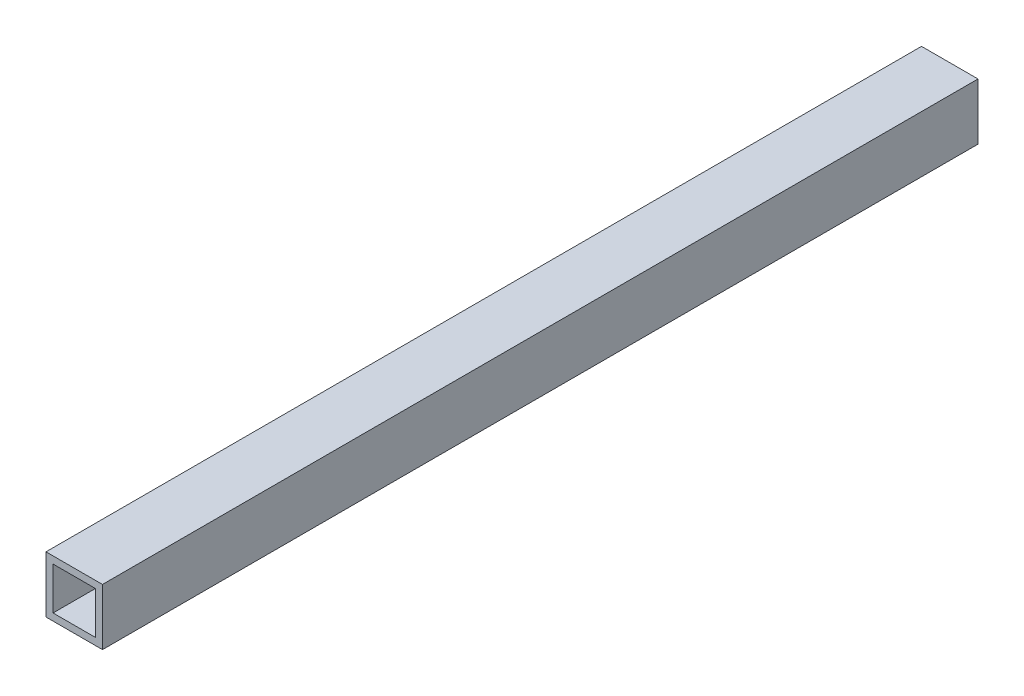
ISO-10303-21;
HEADER;
FILE_DESCRIPTION(('STEP AP214'),'2;1');
FILE_NAME('part.step','',(''),(''),'','','');
FILE_SCHEMA(('AUTOMOTIVE_DESIGN { 1 0 10303 214 1 1 1 1 }'));
ENDSEC;
DATA;
#1=APPLICATION_CONTEXT('core data for automotive mechanical design processes');
#2=APPLICATION_PROTOCOL_DEFINITION('international standard','automotive_design',2000,#1);
#3=PRODUCT_CONTEXT('',#1,'mechanical');
#4=PRODUCT('Part','Part','',(#3));
#5=PRODUCT_RELATED_PRODUCT_CATEGORY('part','',(#4));
#6=PRODUCT_DEFINITION_FORMATION('','',#4);
#7=PRODUCT_DEFINITION_CONTEXT('part definition',#1,'design');
#8=PRODUCT_DEFINITION('design','',#6,#7);
#9=PRODUCT_DEFINITION_SHAPE('','',#8);
#10=(LENGTH_UNIT() NAMED_UNIT(*) SI_UNIT(.MILLI.,.METRE.));
#11=(NAMED_UNIT(*) PLANE_ANGLE_UNIT() SI_UNIT($,.RADIAN.));
#12=(NAMED_UNIT(*) SI_UNIT($,.STERADIAN.) SOLID_ANGLE_UNIT());
#13=UNCERTAINTY_MEASURE_WITH_UNIT(LENGTH_MEASURE(1.E-05),#10,'distance_accuracy_value','');
#14=(GEOMETRIC_REPRESENTATION_CONTEXT(3) GLOBAL_UNCERTAINTY_ASSIGNED_CONTEXT((#13)) GLOBAL_UNIT_ASSIGNED_CONTEXT((#10,
#11,#12)) REPRESENTATION_CONTEXT('',''));
#15=CARTESIAN_POINT('',(0.,0.,0.));
#16=DIRECTION('',(0.,0.,1.));
#17=DIRECTION('',(1.,0.,0.));
#18=AXIS2_PLACEMENT_3D('',#15,#16,#17);
#19=CARTESIAN_POINT('',(0.,0.,196.85));
#20=DIRECTION('',(0.,0.,1.));
#21=DIRECTION('',(1.,0.,0.));
#22=AXIS2_PLACEMENT_3D('',#19,#20,#21);
#23=PLANE('',#22);
#24=DIRECTION('',(0.,-1.,0.));
#25=VECTOR('',#24,1.);
#26=CARTESIAN_POINT('',(-12.7,-12.7,196.85));
#27=LINE('',#26,#25);
#28=CARTESIAN_POINT('',(-12.7,12.7,196.85));
#29=VERTEX_POINT('',#28);
#30=CARTESIAN_POINT('',(-12.7,-12.7,196.85));
#31=VERTEX_POINT('',#30);
#32=EDGE_CURVE('E151',#29,#31,#27,.T.);
#33=ORIENTED_EDGE('',*,*,#32,.T.);
#34=DIRECTION('',(1.,0.,0.));
#35=VECTOR('',#34,1.);
#36=CARTESIAN_POINT('',(12.7,-12.7,196.85));
#37=LINE('',#36,#35);
#38=CARTESIAN_POINT('',(12.7,-12.7,196.85));
#39=VERTEX_POINT('',#38);
#40=EDGE_CURVE('E154',#31,#39,#37,.T.);
#41=ORIENTED_EDGE('',*,*,#40,.T.);
#42=DIRECTION('',(0.,1.,0.));
#43=VECTOR('',#42,1.);
#44=CARTESIAN_POINT('',(12.7,-12.7,196.85));
#45=LINE('',#44,#43);
#46=CARTESIAN_POINT('',(12.7,12.7,196.85));
#47=VERTEX_POINT('',#46);
#48=EDGE_CURVE('E157',#39,#47,#45,.T.);
#49=ORIENTED_EDGE('',*,*,#48,.T.);
#50=DIRECTION('',(-1.,0.,0.));
#51=VECTOR('',#50,1.);
#52=CARTESIAN_POINT('',(12.7,12.7,196.85));
#53=LINE('',#52,#51);
#54=EDGE_CURVE('E159',#47,#29,#53,.T.);
#55=ORIENTED_EDGE('',*,*,#54,.T.);
#56=EDGE_LOOP('',(#33,#41,#49,#55));
#57=FACE_BOUND('',#56,.T.);
#58=DIRECTION('',(1.,0.,0.));
#59=VECTOR('',#58,1.);
#60=CARTESIAN_POINT('',(9.525,-9.525,196.85));
#61=LINE('',#60,#59);
#62=CARTESIAN_POINT('',(-9.525,-9.525,196.85));
#63=VERTEX_POINT('',#62);
#64=CARTESIAN_POINT('',(9.525,-9.525,196.85));
#65=VERTEX_POINT('',#64);
#66=EDGE_CURVE('E118',#63,#65,#61,.T.);
#67=ORIENTED_EDGE('',*,*,#66,.F.);
#68=DIRECTION('',(0.,-1.,0.));
#69=VECTOR('',#68,1.);
#70=CARTESIAN_POINT('',(-9.525,-9.525,196.85));
#71=LINE('',#70,#69);
#72=CARTESIAN_POINT('',(-9.525,9.525,196.85));
#73=VERTEX_POINT('',#72);
#74=EDGE_CURVE('E110',#73,#63,#71,.T.);
#75=ORIENTED_EDGE('',*,*,#74,.F.);
#76=DIRECTION('',(-1.,0.,0.));
#77=VECTOR('',#76,1.);
#78=CARTESIAN_POINT('',(9.525,9.525,196.85));
#79=LINE('',#78,#77);
#80=CARTESIAN_POINT('',(9.525,9.525,196.85));
#81=VERTEX_POINT('',#80);
#82=EDGE_CURVE('E133',#81,#73,#79,.T.);
#83=ORIENTED_EDGE('',*,*,#82,.F.);
#84=DIRECTION('',(0.,1.,0.));
#85=VECTOR('',#84,1.);
#86=CARTESIAN_POINT('',(9.525,-9.525,196.85));
#87=LINE('',#86,#85);
#88=EDGE_CURVE('E131',#65,#81,#87,.T.);
#89=ORIENTED_EDGE('',*,*,#88,.F.);
#90=EDGE_LOOP('',(#67,#75,#83,#89));
#91=FACE_BOUND('',#90,.T.);
#92=ADVANCED_FACE('F40',(#57,#91),#23,.T.);
#93=CARTESIAN_POINT('',(0.,0.,-196.85));
#94=DIRECTION('',(0.,0.,1.));
#95=DIRECTION('',(1.,0.,0.));
#96=AXIS2_PLACEMENT_3D('',#93,#94,#95);
#97=PLANE('',#96);
#98=DIRECTION('',(0.,-1.,0.));
#99=VECTOR('',#98,1.);
#100=CARTESIAN_POINT('',(-12.7,-12.7,-196.85));
#101=LINE('',#100,#99);
#102=CARTESIAN_POINT('',(-12.7,12.7,-196.85));
#103=VERTEX_POINT('',#102);
#104=CARTESIAN_POINT('',(-12.7,-12.7,-196.85));
#105=VERTEX_POINT('',#104);
#106=EDGE_CURVE('E127',#103,#105,#101,.T.);
#107=ORIENTED_EDGE('',*,*,#106,.F.);
#108=DIRECTION('',(-1.,0.,0.));
#109=VECTOR('',#108,1.);
#110=CARTESIAN_POINT('',(12.7,12.7,-196.85));
#111=LINE('',#110,#109);
#112=CARTESIAN_POINT('',(12.7,12.7,-196.85));
#113=VERTEX_POINT('',#112);
#114=EDGE_CURVE('E155',#113,#103,#111,.T.);
#115=ORIENTED_EDGE('',*,*,#114,.F.);
#116=DIRECTION('',(0.,1.,0.));
#117=VECTOR('',#116,1.);
#118=CARTESIAN_POINT('',(12.7,-12.7,-196.85));
#119=LINE('',#118,#117);
#120=CARTESIAN_POINT('',(12.7,-12.7,-196.85));
#121=VERTEX_POINT('',#120);
#122=EDGE_CURVE('E168',#121,#113,#119,.T.);
#123=ORIENTED_EDGE('',*,*,#122,.F.);
#124=DIRECTION('',(1.,0.,0.));
#125=VECTOR('',#124,1.);
#126=CARTESIAN_POINT('',(12.7,-12.7,-196.85));
#127=LINE('',#126,#125);
#128=EDGE_CURVE('E165',#105,#121,#127,.T.);
#129=ORIENTED_EDGE('',*,*,#128,.F.);
#130=EDGE_LOOP('',(#107,#115,#123,#129));
#131=FACE_BOUND('',#130,.T.);
#132=DIRECTION('',(0.,-1.,0.));
#133=VECTOR('',#132,1.);
#134=CARTESIAN_POINT('',(-9.525,-9.525,-196.85));
#135=LINE('',#134,#133);
#136=CARTESIAN_POINT('',(-9.525,9.525,-196.85));
#137=VERTEX_POINT('',#136);
#138=CARTESIAN_POINT('',(-9.525,-9.525,-196.85));
#139=VERTEX_POINT('',#138);
#140=EDGE_CURVE('E67',#137,#139,#135,.T.);
#141=ORIENTED_EDGE('',*,*,#140,.T.);
#142=DIRECTION('',(1.,0.,0.));
#143=VECTOR('',#142,1.);
#144=CARTESIAN_POINT('',(9.525,-9.525,-196.85));
#145=LINE('',#144,#143);
#146=CARTESIAN_POINT('',(9.525,-9.525,-196.85));
#147=VERTEX_POINT('',#146);
#148=EDGE_CURVE('E125',#139,#147,#145,.T.);
#149=ORIENTED_EDGE('',*,*,#148,.T.);
#150=DIRECTION('',(0.,1.,0.));
#151=VECTOR('',#150,1.);
#152=CARTESIAN_POINT('',(9.525,-9.525,-196.85));
#153=LINE('',#152,#151);
#154=CARTESIAN_POINT('',(9.525,9.525,-196.85));
#155=VERTEX_POINT('',#154);
#156=EDGE_CURVE('E141',#147,#155,#153,.T.);
#157=ORIENTED_EDGE('',*,*,#156,.T.);
#158=DIRECTION('',(-1.,0.,0.));
#159=VECTOR('',#158,1.);
#160=CARTESIAN_POINT('',(9.525,9.525,-196.85));
#161=LINE('',#160,#159);
#162=EDGE_CURVE('E119',#155,#137,#161,.T.);
#163=ORIENTED_EDGE('',*,*,#162,.T.);
#164=EDGE_LOOP('',(#141,#149,#157,#163));
#165=FACE_BOUND('',#164,.T.);
#166=ADVANCED_FACE('F188',(#131,#165),#97,.F.);
#167=CARTESIAN_POINT('',(-12.7,-12.7,196.85));
#168=DIRECTION('',(1.,0.,0.));
#169=DIRECTION('',(0.,0.,-1.));
#170=AXIS2_PLACEMENT_3D('',#167,#168,#169);
#171=PLANE('',#170);
#172=ORIENTED_EDGE('',*,*,#106,.T.);
#173=DIRECTION('',(0.,0.,-1.));
#174=VECTOR('',#173,1.);
#175=CARTESIAN_POINT('',(-12.7,-12.7,196.85));
#176=LINE('',#175,#174);
#177=EDGE_CURVE('E11',#31,#105,#176,.T.);
#178=ORIENTED_EDGE('',*,*,#177,.F.);
#179=ORIENTED_EDGE('',*,*,#32,.F.);
#180=DIRECTION('',(0.,0.,-1.));
#181=VECTOR('',#180,1.);
#182=CARTESIAN_POINT('',(-12.7,12.7,196.85));
#183=LINE('',#182,#181);
#184=EDGE_CURVE('E161',#29,#103,#183,.T.);
#185=ORIENTED_EDGE('',*,*,#184,.T.);
#186=EDGE_LOOP('',(#172,#178,#179,#185));
#187=FACE_BOUND('',#186,.T.);
#188=ADVANCED_FACE('F42',(#187),#171,.F.);
#189=CARTESIAN_POINT('',(12.7,-12.7,196.85));
#190=DIRECTION('',(0.,1.,0.));
#191=DIRECTION('',(-1.,0.,0.));
#192=AXIS2_PLACEMENT_3D('',#189,#190,#191);
#193=PLANE('',#192);
#194=ORIENTED_EDGE('',*,*,#128,.T.);
#195=DIRECTION('',(0.,0.,-1.));
#196=VECTOR('',#195,1.);
#197=CARTESIAN_POINT('',(12.7,-12.7,196.85));
#198=LINE('',#197,#196);
#199=EDGE_CURVE('E49',#39,#121,#198,.T.);
#200=ORIENTED_EDGE('',*,*,#199,.F.);
#201=ORIENTED_EDGE('',*,*,#40,.F.);
#202=ORIENTED_EDGE('',*,*,#177,.T.);
#203=EDGE_LOOP('',(#194,#200,#201,#202));
#204=FACE_BOUND('',#203,.T.);
#205=ADVANCED_FACE('F198',(#204),#193,.F.);
#206=CARTESIAN_POINT('',(12.7,-12.7,196.85));
#207=DIRECTION('',(-1.,0.,0.));
#208=DIRECTION('',(0.,0.,1.));
#209=AXIS2_PLACEMENT_3D('',#206,#207,#208);
#210=PLANE('',#209);
#211=ORIENTED_EDGE('',*,*,#122,.T.);
#212=DIRECTION('',(0.,0.,-1.));
#213=VECTOR('',#212,1.);
#214=CARTESIAN_POINT('',(12.7,12.7,196.85));
#215=LINE('',#214,#213);
#216=EDGE_CURVE('E175',#47,#113,#215,.T.);
#217=ORIENTED_EDGE('',*,*,#216,.F.);
#218=ORIENTED_EDGE('',*,*,#48,.F.);
#219=ORIENTED_EDGE('',*,*,#199,.T.);
#220=EDGE_LOOP('',(#211,#217,#218,#219));
#221=FACE_BOUND('',#220,.T.);
#222=ADVANCED_FACE('F182',(#221),#210,.F.);
#223=CARTESIAN_POINT('',(12.7,12.7,196.85));
#224=DIRECTION('',(0.,-1.,0.));
#225=DIRECTION('',(1.,0.,0.));
#226=AXIS2_PLACEMENT_3D('',#223,#224,#225);
#227=PLANE('',#226);
#228=ORIENTED_EDGE('',*,*,#114,.T.);
#229=ORIENTED_EDGE('',*,*,#184,.F.);
#230=ORIENTED_EDGE('',*,*,#54,.F.);
#231=ORIENTED_EDGE('',*,*,#216,.T.);
#232=EDGE_LOOP('',(#228,#229,#230,#231));
#233=FACE_BOUND('',#232,.T.);
#234=ADVANCED_FACE('F192',(#233),#227,.F.);
#235=CARTESIAN_POINT('',(-9.525,-9.525,196.85));
#236=DIRECTION('',(1.,0.,0.));
#237=DIRECTION('',(0.,0.,-1.));
#238=AXIS2_PLACEMENT_3D('',#235,#236,#237);
#239=PLANE('',#238);
#240=ORIENTED_EDGE('',*,*,#140,.F.);
#241=DIRECTION('',(0.,0.,-1.));
#242=VECTOR('',#241,1.);
#243=CARTESIAN_POINT('',(-9.525,9.525,196.85));
#244=LINE('',#243,#242);
#245=EDGE_CURVE('E114',#73,#137,#244,.T.);
#246=ORIENTED_EDGE('',*,*,#245,.F.);
#247=ORIENTED_EDGE('',*,*,#74,.T.);
#248=DIRECTION('',(0.,0.,-1.));
#249=VECTOR('',#248,1.);
#250=CARTESIAN_POINT('',(-9.525,-9.525,196.85));
#251=LINE('',#250,#249);
#252=EDGE_CURVE('E113',#63,#139,#251,.T.);
#253=ORIENTED_EDGE('',*,*,#252,.T.);
#254=EDGE_LOOP('',(#240,#246,#247,#253));
#255=FACE_BOUND('',#254,.T.);
#256=ADVANCED_FACE('F112',(#255),#239,.T.);
#257=CARTESIAN_POINT('',(9.525,-9.525,196.85));
#258=DIRECTION('',(0.,1.,0.));
#259=DIRECTION('',(0.,0.,1.));
#260=AXIS2_PLACEMENT_3D('',#257,#258,#259);
#261=PLANE('',#260);
#262=ORIENTED_EDGE('',*,*,#148,.F.);
#263=ORIENTED_EDGE('',*,*,#252,.F.);
#264=ORIENTED_EDGE('',*,*,#66,.T.);
#265=DIRECTION('',(0.,0.,-1.));
#266=VECTOR('',#265,1.);
#267=CARTESIAN_POINT('',(9.525,-9.525,196.85));
#268=LINE('',#267,#266);
#269=EDGE_CURVE('E128',#65,#147,#268,.T.);
#270=ORIENTED_EDGE('',*,*,#269,.T.);
#271=EDGE_LOOP('',(#262,#263,#264,#270));
#272=FACE_BOUND('',#271,.T.);
#273=ADVANCED_FACE('F122',(#272),#261,.T.);
#274=CARTESIAN_POINT('',(9.525,-9.525,196.85));
#275=DIRECTION('',(-1.,0.,0.));
#276=DIRECTION('',(0.,0.,1.));
#277=AXIS2_PLACEMENT_3D('',#274,#275,#276);
#278=PLANE('',#277);
#279=ORIENTED_EDGE('',*,*,#156,.F.);
#280=ORIENTED_EDGE('',*,*,#269,.F.);
#281=ORIENTED_EDGE('',*,*,#88,.T.);
#282=DIRECTION('',(0.,0.,-1.));
#283=VECTOR('',#282,1.);
#284=CARTESIAN_POINT('',(9.525,9.525,196.85));
#285=LINE('',#284,#283);
#286=EDGE_CURVE('E56',#81,#155,#285,.T.);
#287=ORIENTED_EDGE('',*,*,#286,.T.);
#288=EDGE_LOOP('',(#279,#280,#281,#287));
#289=FACE_BOUND('',#288,.T.);
#290=ADVANCED_FACE('F221',(#289),#278,.T.);
#291=CARTESIAN_POINT('',(9.525,9.525,196.85));
#292=DIRECTION('',(0.,-1.,0.));
#293=DIRECTION('',(0.,0.,-1.));
#294=AXIS2_PLACEMENT_3D('',#291,#292,#293);
#295=PLANE('',#294);
#296=ORIENTED_EDGE('',*,*,#162,.F.);
#297=ORIENTED_EDGE('',*,*,#286,.F.);
#298=ORIENTED_EDGE('',*,*,#82,.T.);
#299=ORIENTED_EDGE('',*,*,#245,.T.);
#300=EDGE_LOOP('',(#296,#297,#298,#299));
#301=FACE_BOUND('',#300,.T.);
#302=ADVANCED_FACE('F225',(#301),#295,.T.);
#303=CLOSED_SHELL('',(#92,#166,#188,#205,#222,#234,#256,#273,#290,#302));
#304=MANIFOLD_SOLID_BREP('B2',#303);
#305=ADVANCED_BREP_SHAPE_REPRESENTATION('',(#18,#304),#14);
#306=SHAPE_DEFINITION_REPRESENTATION(#9,#305);
ENDSEC;
END-ISO-10303-21;
